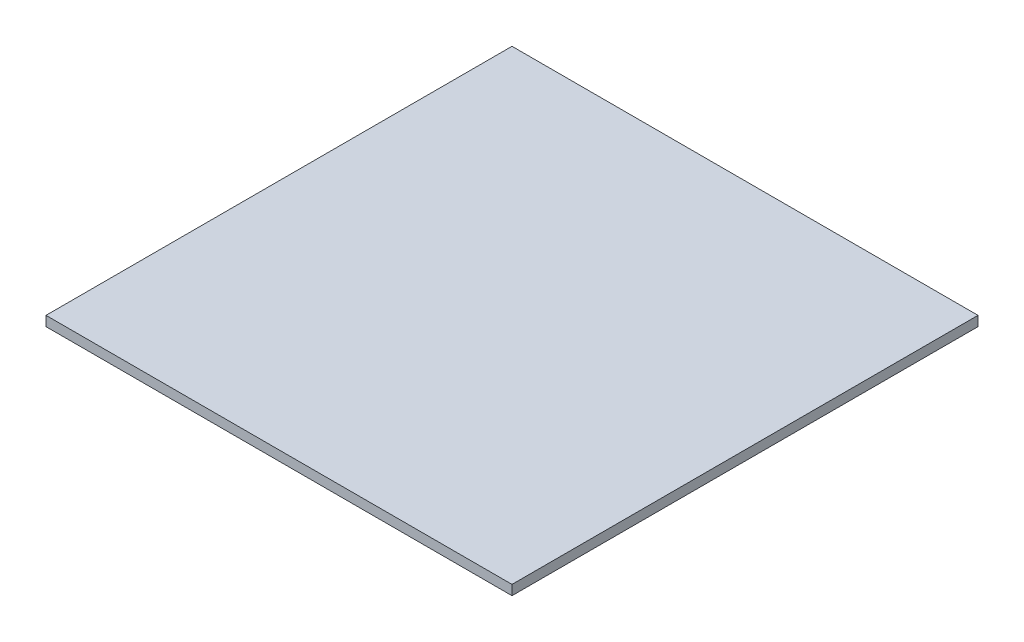
ISO-10303-21;
HEADER;
FILE_DESCRIPTION(('STEP AP214'),'2;1');
FILE_NAME('part.step','',(''),(''),'','','');
FILE_SCHEMA(('AUTOMOTIVE_DESIGN { 1 0 10303 214 1 1 1 1 }'));
ENDSEC;
DATA;
#1=APPLICATION_CONTEXT('core data for automotive mechanical design processes');
#2=APPLICATION_PROTOCOL_DEFINITION('international standard','automotive_design',2000,#1);
#3=PRODUCT_CONTEXT('',#1,'mechanical');
#4=PRODUCT('Part','Part','',(#3));
#5=PRODUCT_RELATED_PRODUCT_CATEGORY('part','',(#4));
#6=PRODUCT_DEFINITION_FORMATION('','',#4);
#7=PRODUCT_DEFINITION_CONTEXT('part definition',#1,'design');
#8=PRODUCT_DEFINITION('design','',#6,#7);
#9=PRODUCT_DEFINITION_SHAPE('','',#8);
#10=(LENGTH_UNIT() NAMED_UNIT(*) SI_UNIT(.MILLI.,.METRE.));
#11=(NAMED_UNIT(*) PLANE_ANGLE_UNIT() SI_UNIT($,.RADIAN.));
#12=(NAMED_UNIT(*) SI_UNIT($,.STERADIAN.) SOLID_ANGLE_UNIT());
#13=UNCERTAINTY_MEASURE_WITH_UNIT(LENGTH_MEASURE(1.E-05),#10,'distance_accuracy_value','');
#14=(GEOMETRIC_REPRESENTATION_CONTEXT(3) GLOBAL_UNCERTAINTY_ASSIGNED_CONTEXT((#13)) GLOBAL_UNIT_ASSIGNED_CONTEXT((#10,
#11,#12)) REPRESENTATION_CONTEXT('',''));
#15=CARTESIAN_POINT('',(0.,0.,0.));
#16=DIRECTION('',(0.,0.,1.));
#17=DIRECTION('',(1.,0.,0.));
#18=AXIS2_PLACEMENT_3D('',#15,#16,#17);
#19=CARTESIAN_POINT('',(0.,0.,950.));
#20=DIRECTION('',(1.,0.,0.));
#21=DIRECTION('',(0.,0.,-1.));
#22=AXIS2_PLACEMENT_3D('',#19,#20,#21);
#23=PLANE('',#22);
#24=DIRECTION('',(0.,-1.,0.));
#25=VECTOR('',#24,1.);
#26=CARTESIAN_POINT('',(0.,0.,0.));
#27=LINE('',#26,#25);
#28=CARTESIAN_POINT('',(0.,20.,0.));
#29=VERTEX_POINT('',#28);
#30=CARTESIAN_POINT('',(0.,0.,0.));
#31=VERTEX_POINT('',#30);
#32=EDGE_CURVE('E106',#29,#31,#27,.T.);
#33=ORIENTED_EDGE('',*,*,#32,.T.);
#34=DIRECTION('',(0.,0.,-1.));
#35=VECTOR('',#34,1.);
#36=CARTESIAN_POINT('',(0.,0.,950.));
#37=LINE('',#36,#35);
#38=CARTESIAN_POINT('',(0.,0.,950.));
#39=VERTEX_POINT('',#38);
#40=EDGE_CURVE('E11',#39,#31,#37,.T.);
#41=ORIENTED_EDGE('',*,*,#40,.F.);
#42=DIRECTION('',(0.,-1.,0.));
#43=VECTOR('',#42,1.);
#44=CARTESIAN_POINT('',(0.,0.,950.));
#45=LINE('',#44,#43);
#46=CARTESIAN_POINT('',(0.,20.,950.));
#47=VERTEX_POINT('',#46);
#48=EDGE_CURVE('E92',#47,#39,#45,.T.);
#49=ORIENTED_EDGE('',*,*,#48,.F.);
#50=DIRECTION('',(0.,0.,-1.));
#51=VECTOR('',#50,1.);
#52=CARTESIAN_POINT('',(0.,20.,950.));
#53=LINE('',#52,#51);
#54=EDGE_CURVE('E105',#47,#29,#53,.T.);
#55=ORIENTED_EDGE('',*,*,#54,.T.);
#56=EDGE_LOOP('',(#33,#41,#49,#55));
#57=FACE_BOUND('',#56,.T.);
#58=ADVANCED_FACE('F43',(#57),#23,.F.);
#59=CARTESIAN_POINT('',(0.,0.,950.));
#60=DIRECTION('',(0.,1.,0.));
#61=DIRECTION('',(0.,0.,1.));
#62=AXIS2_PLACEMENT_3D('',#59,#60,#61);
#63=PLANE('',#62);
#64=DIRECTION('',(1.,0.,0.));
#65=VECTOR('',#64,1.);
#66=CARTESIAN_POINT('',(0.,0.,0.));
#67=LINE('',#66,#65);
#68=CARTESIAN_POINT('',(950.,0.,0.));
#69=VERTEX_POINT('',#68);
#70=EDGE_CURVE('E97',#31,#69,#67,.T.);
#71=ORIENTED_EDGE('',*,*,#70,.T.);
#72=DIRECTION('',(0.,0.,-1.));
#73=VECTOR('',#72,1.);
#74=CARTESIAN_POINT('',(950.,0.,950.));
#75=LINE('',#74,#73);
#76=CARTESIAN_POINT('',(950.,0.,950.));
#77=VERTEX_POINT('',#76);
#78=EDGE_CURVE('E51',#77,#69,#75,.T.);
#79=ORIENTED_EDGE('',*,*,#78,.F.);
#80=DIRECTION('',(1.,0.,0.));
#81=VECTOR('',#80,1.);
#82=CARTESIAN_POINT('',(0.,0.,950.));
#83=LINE('',#82,#81);
#84=EDGE_CURVE('E87',#39,#77,#83,.T.);
#85=ORIENTED_EDGE('',*,*,#84,.F.);
#86=ORIENTED_EDGE('',*,*,#40,.T.);
#87=EDGE_LOOP('',(#71,#79,#85,#86));
#88=FACE_BOUND('',#87,.T.);
#89=ADVANCED_FACE('F100',(#88),#63,.F.);
#90=CARTESIAN_POINT('',(950.,0.,950.));
#91=DIRECTION('',(-1.,0.,0.));
#92=DIRECTION('',(0.,0.,1.));
#93=AXIS2_PLACEMENT_3D('',#90,#91,#92);
#94=PLANE('',#93);
#95=DIRECTION('',(0.,1.,0.));
#96=VECTOR('',#95,1.);
#97=CARTESIAN_POINT('',(950.,0.,0.));
#98=LINE('',#97,#96);
#99=CARTESIAN_POINT('',(950.,20.,0.));
#100=VERTEX_POINT('',#99);
#101=EDGE_CURVE('E78',#69,#100,#98,.T.);
#102=ORIENTED_EDGE('',*,*,#101,.T.);
#103=DIRECTION('',(0.,0.,-1.));
#104=VECTOR('',#103,1.);
#105=CARTESIAN_POINT('',(950.,20.,950.));
#106=LINE('',#105,#104);
#107=CARTESIAN_POINT('',(950.,20.,950.));
#108=VERTEX_POINT('',#107);
#109=EDGE_CURVE('E98',#108,#100,#106,.T.);
#110=ORIENTED_EDGE('',*,*,#109,.F.);
#111=DIRECTION('',(0.,1.,0.));
#112=VECTOR('',#111,1.);
#113=CARTESIAN_POINT('',(950.,0.,950.));
#114=LINE('',#113,#112);
#115=EDGE_CURVE('E95',#77,#108,#114,.T.);
#116=ORIENTED_EDGE('',*,*,#115,.F.);
#117=ORIENTED_EDGE('',*,*,#78,.T.);
#118=EDGE_LOOP('',(#102,#110,#116,#117));
#119=FACE_BOUND('',#118,.T.);
#120=ADVANCED_FACE('F99',(#119),#94,.F.);
#121=CARTESIAN_POINT('',(0.,20.,950.));
#122=DIRECTION('',(0.,-1.,0.));
#123=DIRECTION('',(0.,0.,-1.));
#124=AXIS2_PLACEMENT_3D('',#121,#122,#123);
#125=PLANE('',#124);
#126=DIRECTION('',(-1.,0.,0.));
#127=VECTOR('',#126,1.);
#128=CARTESIAN_POINT('',(0.,20.,0.));
#129=LINE('',#128,#127);
#130=EDGE_CURVE('E85',#100,#29,#129,.T.);
#131=ORIENTED_EDGE('',*,*,#130,.T.);
#132=ORIENTED_EDGE('',*,*,#54,.F.);
#133=DIRECTION('',(-1.,0.,0.));
#134=VECTOR('',#133,1.);
#135=CARTESIAN_POINT('',(0.,20.,950.));
#136=LINE('',#135,#134);
#137=EDGE_CURVE('E56',#108,#47,#136,.T.);
#138=ORIENTED_EDGE('',*,*,#137,.F.);
#139=ORIENTED_EDGE('',*,*,#109,.T.);
#140=EDGE_LOOP('',(#131,#132,#138,#139));
#141=FACE_BOUND('',#140,.T.);
#142=ADVANCED_FACE('F111',(#141),#125,.F.);
#143=CARTESIAN_POINT('',(0.,0.,950.));
#144=DIRECTION('',(0.,0.,-1.));
#145=DIRECTION('',(-1.,0.,0.));
#146=AXIS2_PLACEMENT_3D('',#143,#144,#145);
#147=PLANE('',#146);
#148=ORIENTED_EDGE('',*,*,#48,.T.);
#149=ORIENTED_EDGE('',*,*,#84,.T.);
#150=ORIENTED_EDGE('',*,*,#115,.T.);
#151=ORIENTED_EDGE('',*,*,#137,.T.);
#152=EDGE_LOOP('',(#148,#149,#150,#151));
#153=FACE_BOUND('',#152,.T.);
#154=ADVANCED_FACE('F89',(#153),#147,.F.);
#155=CARTESIAN_POINT('',(0.,0.,0.));
#156=DIRECTION('',(0.,0.,-1.));
#157=DIRECTION('',(-1.,0.,0.));
#158=AXIS2_PLACEMENT_3D('',#155,#156,#157);
#159=PLANE('',#158);
#160=ORIENTED_EDGE('',*,*,#32,.F.);
#161=ORIENTED_EDGE('',*,*,#130,.F.);
#162=ORIENTED_EDGE('',*,*,#101,.F.);
#163=ORIENTED_EDGE('',*,*,#70,.F.);
#164=EDGE_LOOP('',(#160,#161,#162,#163));
#165=FACE_BOUND('',#164,.T.);
#166=ADVANCED_FACE('F116',(#165),#159,.T.);
#167=CLOSED_SHELL('',(#58,#89,#120,#142,#154,#166));
#168=MANIFOLD_SOLID_BREP('B2',#167);
#169=ADVANCED_BREP_SHAPE_REPRESENTATION('',(#18,#168),#14);
#170=SHAPE_DEFINITION_REPRESENTATION(#9,#169);
ENDSEC;
END-ISO-10303-21;
